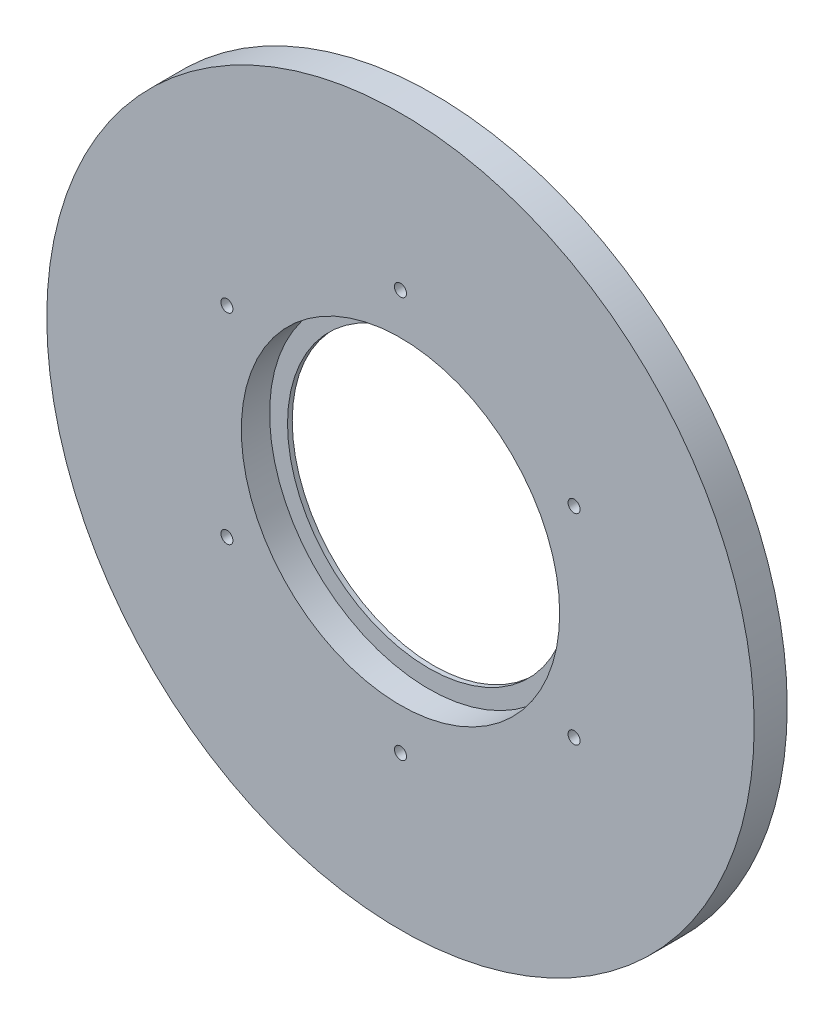
ISO-10303-21;
HEADER;
FILE_DESCRIPTION(('STEP AP214'),'2;1');
FILE_NAME('part.step','',(''),(''),'','','');
FILE_SCHEMA(('AUTOMOTIVE_DESIGN { 1 0 10303 214 1 1 1 1 }'));
ENDSEC;
DATA;
#1=APPLICATION_CONTEXT('core data for automotive mechanical design processes');
#2=APPLICATION_PROTOCOL_DEFINITION('international standard','automotive_design',2000,#1);
#3=PRODUCT_CONTEXT('',#1,'mechanical');
#4=PRODUCT('Part','Part','',(#3));
#5=PRODUCT_RELATED_PRODUCT_CATEGORY('part','',(#4));
#6=PRODUCT_DEFINITION_FORMATION('','',#4);
#7=PRODUCT_DEFINITION_CONTEXT('part definition',#1,'design');
#8=PRODUCT_DEFINITION('design','',#6,#7);
#9=PRODUCT_DEFINITION_SHAPE('','',#8);
#10=(LENGTH_UNIT() NAMED_UNIT(*) SI_UNIT(.MILLI.,.METRE.));
#11=(NAMED_UNIT(*) PLANE_ANGLE_UNIT() SI_UNIT($,.RADIAN.));
#12=(NAMED_UNIT(*) SI_UNIT($,.STERADIAN.) SOLID_ANGLE_UNIT());
#13=UNCERTAINTY_MEASURE_WITH_UNIT(LENGTH_MEASURE(1.E-05),#10,'distance_accuracy_value','');
#14=(GEOMETRIC_REPRESENTATION_CONTEXT(3) GLOBAL_UNCERTAINTY_ASSIGNED_CONTEXT((#13)) GLOBAL_UNIT_ASSIGNED_CONTEXT((#10,
#11,#12)) REPRESENTATION_CONTEXT('',''));
#15=CARTESIAN_POINT('',(0.,0.,0.));
#16=DIRECTION('',(0.,0.,1.));
#17=DIRECTION('',(1.,0.,0.));
#18=AXIS2_PLACEMENT_3D('',#15,#16,#17);
#19=CARTESIAN_POINT('',(0.,0.,513.500012931734));
#20=DIRECTION('',(0.,0.,-1.));
#21=DIRECTION('',(0.,-1.,0.));
#22=AXIS2_PLACEMENT_3D('',#19,#20,#21);
#23=PLANE('',#22);
#24=CARTESIAN_POINT('',(147.224319303959,84.9999988558001,513.500013408569));
#25=DIRECTION('',(0.,0.,-1.));
#26=DIRECTION('',(1.,-7.77181222427865E-09,0.));
#27=AXIS2_PLACEMENT_3D('',#24,#25,#26);
#28=CIRCLE('',#27,5.1);
#29=CARTESIAN_POINT('',(142.124319303959,84.9999988954363,513.500013408569));
#30=VERTEX_POINT('',#29);
#31=EDGE_CURVE('E115',#30,#30,#28,.T.);
#32=ORIENTED_EDGE('',*,*,#31,.T.);
#33=EDGE_LOOP('',(#32));
#34=FACE_BOUND('',#33,.T.);
#35=CARTESIAN_POINT('',(-147.224317982751,85.0000011441997,513.500013408569));
#36=DIRECTION('',(0.,0.,-1.));
#37=DIRECTION('',(1.,-7.77181222427865E-09,0.));
#38=AXIS2_PLACEMENT_3D('',#35,#36,#37);
#39=CIRCLE('',#38,5.1);
#40=CARTESIAN_POINT('',(-152.324317982751,85.0000011838359,513.500013408569));
#41=VERTEX_POINT('',#40);
#42=EDGE_CURVE('E184',#41,#41,#39,.T.);
#43=ORIENTED_EDGE('',*,*,#42,.T.);
#44=EDGE_LOOP('',(#43));
#45=FACE_BOUND('',#44,.T.);
#46=CARTESIAN_POINT('',(-1.32120811180414E-06,-170.,513.500013408569));
#47=DIRECTION('',(0.,0.,-1.));
#48=DIRECTION('',(1.,-7.77181222427866E-09,0.));
#49=AXIS2_PLACEMENT_3D('',#46,#47,#48);
#50=CIRCLE('',#49,5.1);
#51=CARTESIAN_POINT('',(-5.10000132120812,-169.999999960364,513.500013408569));
#52=VERTEX_POINT('',#51);
#53=EDGE_CURVE('E147',#52,#52,#50,.T.);
#54=ORIENTED_EDGE('',*,*,#53,.T.);
#55=EDGE_LOOP('',(#54));
#56=FACE_BOUND('',#55,.T.);
#57=CARTESIAN_POINT('',(147.22431798275,-85.0000011441999,513.500013408569));
#58=DIRECTION('',(0.,0.,-1.));
#59=DIRECTION('',(1.,-7.77181222427865E-09,0.));
#60=AXIS2_PLACEMENT_3D('',#57,#58,#59);
#61=CIRCLE('',#60,5.1);
#62=CARTESIAN_POINT('',(142.12431798275,-85.0000011045636,513.500013408569));
#63=VERTEX_POINT('',#62);
#64=EDGE_CURVE('E129',#63,#63,#61,.T.);
#65=ORIENTED_EDGE('',*,*,#64,.T.);
#66=EDGE_LOOP('',(#65));
#67=FACE_BOUND('',#66,.T.);
#68=CARTESIAN_POINT('',(1.32120806739522E-06,170.,513.500013408569));
#69=DIRECTION('',(0.,0.,-1.));
#70=DIRECTION('',(1.,-7.77181222427866E-09,0.));
#71=AXIS2_PLACEMENT_3D('',#68,#69,#70);
#72=CIRCLE('',#71,5.1);
#73=CARTESIAN_POINT('',(-5.09999867879194,170.000000039636,513.500013408569));
#74=VERTEX_POINT('',#73);
#75=EDGE_CURVE('E137',#74,#74,#72,.T.);
#76=ORIENTED_EDGE('',*,*,#75,.T.);
#77=EDGE_LOOP('',(#76));
#78=FACE_BOUND('',#77,.T.);
#79=CARTESIAN_POINT('',(-147.224319303959,-84.9999988558003,513.500013408569));
#80=DIRECTION('',(0.,0.,-1.));
#81=DIRECTION('',(1.,-7.77181222427865E-09,0.));
#82=AXIS2_PLACEMENT_3D('',#79,#80,#81);
#83=CIRCLE('',#82,5.1);
#84=CARTESIAN_POINT('',(-152.324319303959,-84.999998816164,513.500013408569));
#85=VERTEX_POINT('',#84);
#86=EDGE_CURVE('E146',#85,#85,#83,.T.);
#87=ORIENTED_EDGE('',*,*,#86,.T.);
#88=EDGE_LOOP('',(#87));
#89=FACE_BOUND('',#88,.T.);
#90=CARTESIAN_POINT('',(0.,0.,513.500012931734));
#91=DIRECTION('',(0.,0.,-1.));
#92=DIRECTION('',(0.5,-0.866025403784439,0.));
#93=AXIS2_PLACEMENT_3D('',#90,#91,#92);
#94=CIRCLE('',#93,135.);
#95=CARTESIAN_POINT('',(-67.5,116.913429510899,513.500012931734));
#96=VERTEX_POINT('',#95);
#97=EDGE_CURVE('E139',#96,#96,#94,.T.);
#98=ORIENTED_EDGE('',*,*,#97,.T.);
#99=EDGE_LOOP('',(#98));
#100=FACE_BOUND('',#99,.T.);
#101=CARTESIAN_POINT('',(0.,0.,513.500012931734));
#102=DIRECTION('',(0.,0.,1.));
#103=DIRECTION('',(-1.,0.,0.));
#104=AXIS2_PLACEMENT_3D('',#101,#102,#103);
#105=CIRCLE('',#104,300.);
#106=CARTESIAN_POINT('',(300.,0.,513.500012931734));
#107=VERTEX_POINT('',#106);
#108=EDGE_CURVE('E105',#107,#107,#105,.T.);
#109=ORIENTED_EDGE('',*,*,#108,.T.);
#110=EDGE_LOOP('',(#109));
#111=FACE_BOUND('',#110,.T.);
#112=ADVANCED_FACE('F17',(#34,#45,#56,#67,#78,#89,#100,#111),#23,.F.);
#113=CARTESIAN_POINT('',(0.,0.,485.500012931734));
#114=DIRECTION('',(0.,0.,-1.));
#115=DIRECTION('',(0.,-1.,0.));
#116=AXIS2_PLACEMENT_3D('',#113,#114,#115);
#117=PLANE('',#116);
#118=CARTESIAN_POINT('',(147.224319303959,84.9999988558001,485.500012931734));
#119=DIRECTION('',(0.,0.,1.));
#120=DIRECTION('',(1.,-7.77181222427865E-09,0.));
#121=AXIS2_PLACEMENT_3D('',#118,#119,#120);
#122=CIRCLE('',#121,5.1);
#123=CARTESIAN_POINT('',(142.124319303959,84.9999988954363,485.500012931734));
#124=VERTEX_POINT('',#123);
#125=EDGE_CURVE('E99',#124,#124,#122,.T.);
#126=ORIENTED_EDGE('',*,*,#125,.T.);
#127=EDGE_LOOP('',(#126));
#128=FACE_BOUND('',#127,.T.);
#129=CARTESIAN_POINT('',(-147.224317982751,85.0000011441997,485.500012931734));
#130=DIRECTION('',(0.,0.,1.));
#131=DIRECTION('',(1.,-7.77181222427865E-09,0.));
#132=AXIS2_PLACEMENT_3D('',#129,#130,#131);
#133=CIRCLE('',#132,5.1);
#134=CARTESIAN_POINT('',(-152.324317982751,85.0000011838359,485.500012931734));
#135=VERTEX_POINT('',#134);
#136=EDGE_CURVE('E157',#135,#135,#133,.T.);
#137=ORIENTED_EDGE('',*,*,#136,.T.);
#138=EDGE_LOOP('',(#137));
#139=FACE_BOUND('',#138,.T.);
#140=CARTESIAN_POINT('',(-1.32120811180414E-06,-170.,485.500012931734));
#141=DIRECTION('',(0.,0.,1.));
#142=DIRECTION('',(1.,-7.77181222427866E-09,0.));
#143=AXIS2_PLACEMENT_3D('',#140,#141,#142);
#144=CIRCLE('',#143,5.1);
#145=CARTESIAN_POINT('',(-5.10000132120811,-169.999999960364,485.500012931734));
#146=VERTEX_POINT('',#145);
#147=EDGE_CURVE('E181',#146,#146,#144,.T.);
#148=ORIENTED_EDGE('',*,*,#147,.T.);
#149=EDGE_LOOP('',(#148));
#150=FACE_BOUND('',#149,.T.);
#151=CARTESIAN_POINT('',(147.22431798275,-85.0000011441999,485.500012931734));
#152=DIRECTION('',(0.,0.,1.));
#153=DIRECTION('',(1.,-7.77181222427865E-09,0.));
#154=AXIS2_PLACEMENT_3D('',#151,#152,#153);
#155=CIRCLE('',#154,5.1);
#156=CARTESIAN_POINT('',(142.12431798275,-85.0000011045636,485.500012931734));
#157=VERTEX_POINT('',#156);
#158=EDGE_CURVE('E128',#157,#157,#155,.T.);
#159=ORIENTED_EDGE('',*,*,#158,.T.);
#160=EDGE_LOOP('',(#159));
#161=FACE_BOUND('',#160,.T.);
#162=CARTESIAN_POINT('',(1.32120806739522E-06,170.,485.500012931734));
#163=DIRECTION('',(0.,0.,1.));
#164=DIRECTION('',(1.,-7.77181222427866E-09,0.));
#165=AXIS2_PLACEMENT_3D('',#162,#163,#164);
#166=CIRCLE('',#165,5.1);
#167=CARTESIAN_POINT('',(-5.09999867879194,170.000000039636,485.500012931734));
#168=VERTEX_POINT('',#167);
#169=EDGE_CURVE('E168',#168,#168,#166,.T.);
#170=ORIENTED_EDGE('',*,*,#169,.T.);
#171=EDGE_LOOP('',(#170));
#172=FACE_BOUND('',#171,.T.);
#173=CARTESIAN_POINT('',(-147.224319303959,-84.9999988558003,485.500012931734));
#174=DIRECTION('',(0.,0.,1.));
#175=DIRECTION('',(1.,-7.77181222427865E-09,0.));
#176=AXIS2_PLACEMENT_3D('',#173,#174,#175);
#177=CIRCLE('',#176,5.1);
#178=CARTESIAN_POINT('',(-152.324319303959,-84.999998816164,485.500012931734));
#179=VERTEX_POINT('',#178);
#180=EDGE_CURVE('E134',#179,#179,#177,.T.);
#181=ORIENTED_EDGE('',*,*,#180,.T.);
#182=EDGE_LOOP('',(#181));
#183=FACE_BOUND('',#182,.T.);
#184=CARTESIAN_POINT('',(0.,0.,485.500012931734));
#185=DIRECTION('',(0.,0.,1.));
#186=DIRECTION('',(0.5,-0.866025403784439,0.));
#187=AXIS2_PLACEMENT_3D('',#184,#185,#186);
#188=CIRCLE('',#187,119.8125);
#189=CARTESIAN_POINT('',(-59.90625,103.760668690923,485.500012931734));
#190=VERTEX_POINT('',#189);
#191=EDGE_CURVE('E123',#190,#190,#188,.T.);
#192=ORIENTED_EDGE('',*,*,#191,.T.);
#193=EDGE_LOOP('',(#192));
#194=FACE_BOUND('',#193,.T.);
#195=CARTESIAN_POINT('',(0.,0.,485.500012931734));
#196=DIRECTION('',(0.,0.,-1.));
#197=DIRECTION('',(-1.,0.,0.));
#198=AXIS2_PLACEMENT_3D('',#195,#196,#197);
#199=CIRCLE('',#198,300.);
#200=CARTESIAN_POINT('',(300.,0.,485.500012931734));
#201=VERTEX_POINT('',#200);
#202=EDGE_CURVE('E11',#201,#201,#199,.T.);
#203=ORIENTED_EDGE('',*,*,#202,.T.);
#204=EDGE_LOOP('',(#203));
#205=FACE_BOUND('',#204,.T.);
#206=ADVANCED_FACE('F100',(#128,#139,#150,#161,#172,#183,#194,#205),#117,.T.);
#207=CARTESIAN_POINT('',(0.,0.,485.500012931734));
#208=DIRECTION('',(0.,0.,1.));
#209=DIRECTION('',(-1.,0.,0.));
#210=AXIS2_PLACEMENT_3D('',#207,#208,#209);
#211=CYLINDRICAL_SURFACE('',#210,300.);
#212=ORIENTED_EDGE('',*,*,#108,.F.);
#213=DIRECTION('',(0.,0.,-1.));
#214=VECTOR('',#213,1.);
#215=CARTESIAN_POINT('',(300.,0.,485.500012931734));
#216=LINE('',#215,#214);
#217=EDGE_CURVE('E27',#107,#201,#216,.T.);
#218=ORIENTED_EDGE('',*,*,#217,.T.);
#219=ORIENTED_EDGE('',*,*,#202,.F.);
#220=ORIENTED_EDGE('',*,*,#217,.F.);
#221=EDGE_LOOP('',(#212,#218,#219,#220));
#222=FACE_BOUND('',#221,.T.);
#223=ADVANCED_FACE('F199',(#222),#211,.T.);
#224=CARTESIAN_POINT('',(147.224319303959,84.9999988558001,517.500029491426));
#225=DIRECTION('',(0.,0.,-1.));
#226=DIRECTION('',(1.,-7.77181222427865E-09,0.));
#227=AXIS2_PLACEMENT_3D('',#224,#225,#226);
#228=CYLINDRICAL_SURFACE('',#227,5.1);
#229=ORIENTED_EDGE('',*,*,#31,.F.);
#230=DIRECTION('',(0.,0.,-1.));
#231=VECTOR('',#230,1.);
#232=CARTESIAN_POINT('',(142.124319303959,84.9999988954363,517.500029491426));
#233=LINE('',#232,#231);
#234=EDGE_CURVE('E106',#30,#124,#233,.T.);
#235=ORIENTED_EDGE('',*,*,#234,.T.);
#236=ORIENTED_EDGE('',*,*,#125,.F.);
#237=ORIENTED_EDGE('',*,*,#234,.F.);
#238=EDGE_LOOP('',(#229,#235,#236,#237));
#239=FACE_BOUND('',#238,.T.);
#240=ADVANCED_FACE('F19',(#239),#228,.F.);
#241=CARTESIAN_POINT('',(-147.224317982751,85.0000011441997,517.500029491426));
#242=DIRECTION('',(0.,0.,-1.));
#243=DIRECTION('',(1.,-7.77181222427865E-09,0.));
#244=AXIS2_PLACEMENT_3D('',#241,#242,#243);
#245=CYLINDRICAL_SURFACE('',#244,5.1);
#246=ORIENTED_EDGE('',*,*,#42,.F.);
#247=DIRECTION('',(0.,0.,-1.));
#248=VECTOR('',#247,1.);
#249=CARTESIAN_POINT('',(-152.324317982751,85.0000011838359,517.500029491426));
#250=LINE('',#249,#248);
#251=EDGE_CURVE('E160',#41,#135,#250,.T.);
#252=ORIENTED_EDGE('',*,*,#251,.T.);
#253=ORIENTED_EDGE('',*,*,#136,.F.);
#254=ORIENTED_EDGE('',*,*,#251,.F.);
#255=EDGE_LOOP('',(#246,#252,#253,#254));
#256=FACE_BOUND('',#255,.T.);
#257=ADVANCED_FACE('F198',(#256),#245,.F.);
#258=CARTESIAN_POINT('',(-1.32120811180414E-06,-170.,517.500029491426));
#259=DIRECTION('',(0.,0.,-1.));
#260=DIRECTION('',(1.,-7.77181222427866E-09,0.));
#261=AXIS2_PLACEMENT_3D('',#258,#259,#260);
#262=CYLINDRICAL_SURFACE('',#261,5.1);
#263=ORIENTED_EDGE('',*,*,#53,.F.);
#264=DIRECTION('',(0.,0.,-1.));
#265=VECTOR('',#264,1.);
#266=CARTESIAN_POINT('',(-5.10000132120812,-169.999999960364,517.500029491426));
#267=LINE('',#266,#265);
#268=EDGE_CURVE('E151',#52,#146,#267,.T.);
#269=ORIENTED_EDGE('',*,*,#268,.T.);
#270=ORIENTED_EDGE('',*,*,#147,.F.);
#271=ORIENTED_EDGE('',*,*,#268,.F.);
#272=EDGE_LOOP('',(#263,#269,#270,#271));
#273=FACE_BOUND('',#272,.T.);
#274=ADVANCED_FACE('F205',(#273),#262,.F.);
#275=CARTESIAN_POINT('',(147.22431798275,-85.0000011441999,517.500029491426));
#276=DIRECTION('',(0.,0.,-1.));
#277=DIRECTION('',(1.,-7.77181222427865E-09,0.));
#278=AXIS2_PLACEMENT_3D('',#275,#276,#277);
#279=CYLINDRICAL_SURFACE('',#278,5.1);
#280=ORIENTED_EDGE('',*,*,#64,.F.);
#281=DIRECTION('',(0.,0.,-1.));
#282=VECTOR('',#281,1.);
#283=CARTESIAN_POINT('',(142.12431798275,-85.0000011045636,517.500029491426));
#284=LINE('',#283,#282);
#285=EDGE_CURVE('E124',#63,#157,#284,.T.);
#286=ORIENTED_EDGE('',*,*,#285,.T.);
#287=ORIENTED_EDGE('',*,*,#158,.F.);
#288=ORIENTED_EDGE('',*,*,#285,.F.);
#289=EDGE_LOOP('',(#280,#286,#287,#288));
#290=FACE_BOUND('',#289,.T.);
#291=ADVANCED_FACE('F220',(#290),#279,.F.);
#292=CARTESIAN_POINT('',(1.32120806739522E-06,170.,517.500029491426));
#293=DIRECTION('',(0.,0.,-1.));
#294=DIRECTION('',(1.,-7.77181222427866E-09,0.));
#295=AXIS2_PLACEMENT_3D('',#292,#293,#294);
#296=CYLINDRICAL_SURFACE('',#295,5.1);
#297=ORIENTED_EDGE('',*,*,#75,.F.);
#298=DIRECTION('',(0.,0.,-1.));
#299=VECTOR('',#298,1.);
#300=CARTESIAN_POINT('',(-5.09999867879194,170.000000039636,517.500029491426));
#301=LINE('',#300,#299);
#302=EDGE_CURVE('E164',#74,#168,#301,.T.);
#303=ORIENTED_EDGE('',*,*,#302,.T.);
#304=ORIENTED_EDGE('',*,*,#169,.F.);
#305=ORIENTED_EDGE('',*,*,#302,.F.);
#306=EDGE_LOOP('',(#297,#303,#304,#305));
#307=FACE_BOUND('',#306,.T.);
#308=ADVANCED_FACE('F217',(#307),#296,.F.);
#309=CARTESIAN_POINT('',(-147.224319303959,-84.9999988558003,517.500029491426));
#310=DIRECTION('',(0.,0.,-1.));
#311=DIRECTION('',(1.,-7.77181222427865E-09,0.));
#312=AXIS2_PLACEMENT_3D('',#309,#310,#311);
#313=CYLINDRICAL_SURFACE('',#312,5.1);
#314=ORIENTED_EDGE('',*,*,#86,.F.);
#315=DIRECTION('',(0.,0.,-1.));
#316=VECTOR('',#315,1.);
#317=CARTESIAN_POINT('',(-152.324319303959,-84.999998816164,517.500029491426));
#318=LINE('',#317,#316);
#319=EDGE_CURVE('E138',#85,#179,#318,.T.);
#320=ORIENTED_EDGE('',*,*,#319,.T.);
#321=ORIENTED_EDGE('',*,*,#180,.F.);
#322=ORIENTED_EDGE('',*,*,#319,.F.);
#323=EDGE_LOOP('',(#314,#320,#321,#322));
#324=FACE_BOUND('',#323,.T.);
#325=ADVANCED_FACE('F268',(#324),#313,.F.);
#326=CARTESIAN_POINT('',(0.,0.,509.500012931734));
#327=DIRECTION('',(0.,0.,1.));
#328=DIRECTION('',(0.5,-0.866025403784439,0.));
#329=AXIS2_PLACEMENT_3D('',#326,#327,#328);
#330=CYLINDRICAL_SURFACE('',#329,135.);
#331=ORIENTED_EDGE('',*,*,#97,.F.);
#332=DIRECTION('',(0.,0.,-1.));
#333=VECTOR('',#332,1.);
#334=CARTESIAN_POINT('',(-67.5,116.913429510899,509.500012931734));
#335=LINE('',#334,#333);
#336=CARTESIAN_POINT('',(-67.5,116.913429510899,489.500012931734));
#337=VERTEX_POINT('',#336);
#338=EDGE_CURVE('E143',#96,#337,#335,.T.);
#339=ORIENTED_EDGE('',*,*,#338,.T.);
#340=CARTESIAN_POINT('',(0.,0.,489.500012931734));
#341=DIRECTION('',(0.,0.,-1.));
#342=DIRECTION('',(0.5,-0.866025403784439,0.));
#343=AXIS2_PLACEMENT_3D('',#340,#341,#342);
#344=CIRCLE('',#343,135.);
#345=EDGE_CURVE('E118',#337,#337,#344,.T.);
#346=ORIENTED_EDGE('',*,*,#345,.T.);
#347=ORIENTED_EDGE('',*,*,#338,.F.);
#348=EDGE_LOOP('',(#331,#339,#346,#347));
#349=FACE_BOUND('',#348,.T.);
#350=ADVANCED_FACE('F242',(#349),#330,.F.);
#351=CARTESIAN_POINT('',(0.,0.,489.500012931734));
#352=DIRECTION('',(0.,0.,-1.));
#353=DIRECTION('',(0.5,-0.866025403784439,0.));
#354=AXIS2_PLACEMENT_3D('',#351,#352,#353);
#355=CYLINDRICAL_SURFACE('',#354,119.8125);
#356=ORIENTED_EDGE('',*,*,#191,.F.);
#357=DIRECTION('',(0.,0.,1.));
#358=VECTOR('',#357,1.);
#359=CARTESIAN_POINT('',(-59.90625,103.760668690923,489.500012931734));
#360=LINE('',#359,#358);
#361=CARTESIAN_POINT('',(-59.90625,103.760668690923,489.500012931734));
#362=VERTEX_POINT('',#361);
#363=EDGE_CURVE('E133',#190,#362,#360,.T.);
#364=ORIENTED_EDGE('',*,*,#363,.T.);
#365=CARTESIAN_POINT('',(0.,0.,489.500012931734));
#366=DIRECTION('',(0.,0.,-1.));
#367=DIRECTION('',(0.5,-0.866025403784439,0.));
#368=AXIS2_PLACEMENT_3D('',#365,#366,#367);
#369=CIRCLE('',#368,119.8125);
#370=EDGE_CURVE('E120',#362,#362,#369,.T.);
#371=ORIENTED_EDGE('',*,*,#370,.F.);
#372=ORIENTED_EDGE('',*,*,#363,.F.);
#373=EDGE_LOOP('',(#356,#364,#371,#372));
#374=FACE_BOUND('',#373,.T.);
#375=ADVANCED_FACE('F257',(#374),#355,.F.);
#376=CARTESIAN_POINT('',(-59.90625,103.760668690923,489.500012931734));
#377=DIRECTION('',(0.,0.,-1.));
#378=DIRECTION('',(0.,-1.,0.));
#379=AXIS2_PLACEMENT_3D('',#376,#377,#378);
#380=PLANE('',#379);
#381=ORIENTED_EDGE('',*,*,#370,.T.);
#382=EDGE_LOOP('',(#381));
#383=FACE_BOUND('',#382,.T.);
#384=ORIENTED_EDGE('',*,*,#345,.F.);
#385=EDGE_LOOP('',(#384));
#386=FACE_BOUND('',#385,.T.);
#387=ADVANCED_FACE('F259',(#383,#386),#380,.F.);
#388=CLOSED_SHELL('',(#112,#206,#223,#240,#257,#274,#291,#308,#325,#350,#375,#387));
#389=MANIFOLD_SOLID_BREP('B1',#388);
#390=ADVANCED_BREP_SHAPE_REPRESENTATION('',(#18,#389),#14);
#391=SHAPE_DEFINITION_REPRESENTATION(#9,#390);
ENDSEC;
END-ISO-10303-21;
